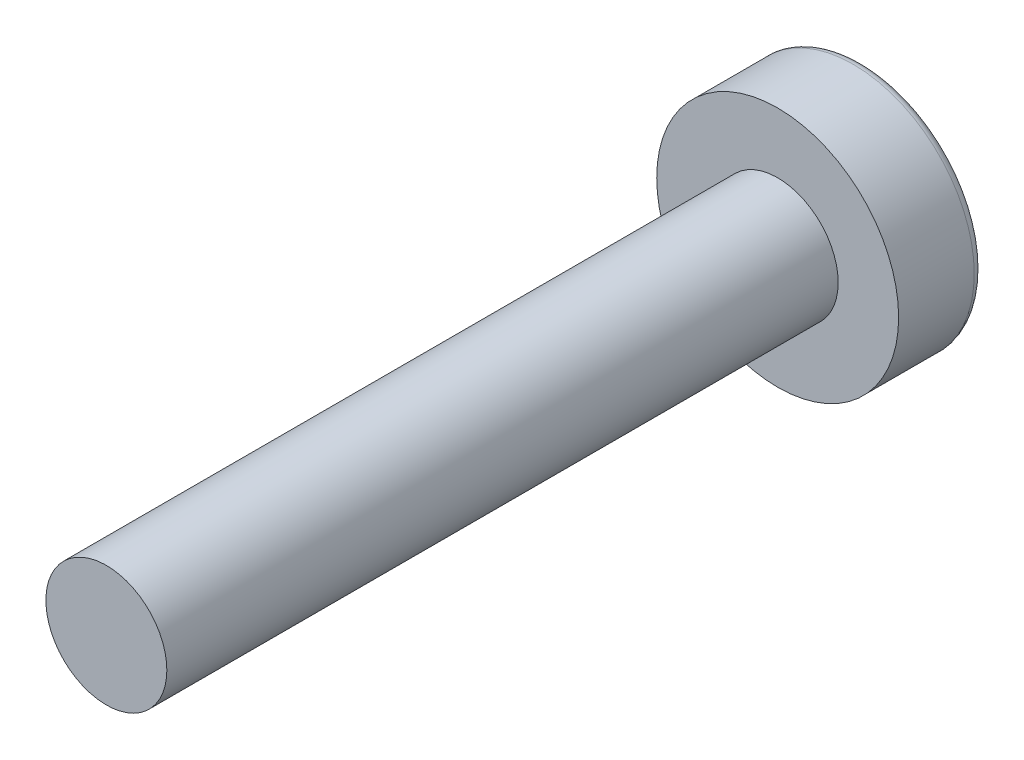
ISO-10303-21;
HEADER;
FILE_DESCRIPTION(('STEP AP214'),'2;1');
FILE_NAME('part.step','',(''),(''),'','','');
FILE_SCHEMA(('AUTOMOTIVE_DESIGN { 1 0 10303 214 1 1 1 1 }'));
ENDSEC;
DATA;
#1=APPLICATION_CONTEXT('core data for automotive mechanical design processes');
#2=APPLICATION_PROTOCOL_DEFINITION('international standard','automotive_design',2000,#1);
#3=PRODUCT_CONTEXT('',#1,'mechanical');
#4=PRODUCT('Part','Part','',(#3));
#5=PRODUCT_RELATED_PRODUCT_CATEGORY('part','',(#4));
#6=PRODUCT_DEFINITION_FORMATION('','',#4);
#7=PRODUCT_DEFINITION_CONTEXT('part definition',#1,'design');
#8=PRODUCT_DEFINITION('design','',#6,#7);
#9=PRODUCT_DEFINITION_SHAPE('','',#8);
#10=(LENGTH_UNIT() NAMED_UNIT(*) SI_UNIT(.MILLI.,.METRE.));
#11=(NAMED_UNIT(*) PLANE_ANGLE_UNIT() SI_UNIT($,.RADIAN.));
#12=(NAMED_UNIT(*) SI_UNIT($,.STERADIAN.) SOLID_ANGLE_UNIT());
#13=UNCERTAINTY_MEASURE_WITH_UNIT(LENGTH_MEASURE(1.E-05),#10,'distance_accuracy_value','');
#14=(GEOMETRIC_REPRESENTATION_CONTEXT(3) GLOBAL_UNCERTAINTY_ASSIGNED_CONTEXT((#13)) GLOBAL_UNIT_ASSIGNED_CONTEXT((#10,
#11,#12)) REPRESENTATION_CONTEXT('',''));
#15=CARTESIAN_POINT('',(0.,0.,0.));
#16=DIRECTION('',(0.,0.,1.));
#17=DIRECTION('',(1.,0.,0.));
#18=AXIS2_PLACEMENT_3D('',#15,#16,#17);
#19=CARTESIAN_POINT('',(0.,0.,2.8));
#20=DIRECTION('',(0.,0.,-1.));
#21=DIRECTION('',(-1.,0.,0.));
#22=AXIS2_PLACEMENT_3D('',#19,#20,#21);
#23=CYLINDRICAL_SURFACE('',#22,4.);
#24=CARTESIAN_POINT('',(0.,0.,0.3));
#25=DIRECTION('',(0.,0.,1.));
#26=DIRECTION('',(1.,0.,0.));
#27=AXIS2_PLACEMENT_3D('',#24,#25,#26);
#28=CIRCLE('',#27,4.);
#29=CARTESIAN_POINT('',(4.,0.,0.3));
#30=VERTEX_POINT('',#29);
#31=EDGE_CURVE('E45',#30,#30,#28,.T.);
#32=ORIENTED_EDGE('',*,*,#31,.T.);
#33=EDGE_LOOP('',(#32));
#34=FACE_BOUND('',#33,.T.);
#35=CARTESIAN_POINT('',(0.,0.,2.8));
#36=DIRECTION('',(0.,0.,1.));
#37=DIRECTION('',(1.,0.,0.));
#38=AXIS2_PLACEMENT_3D('',#35,#36,#37);
#39=CIRCLE('',#38,4.);
#40=CARTESIAN_POINT('',(4.,0.,2.8));
#41=VERTEX_POINT('',#40);
#42=EDGE_CURVE('E55',#41,#41,#39,.T.);
#43=ORIENTED_EDGE('',*,*,#42,.F.);
#44=EDGE_LOOP('',(#43));
#45=FACE_BOUND('',#44,.T.);
#46=ADVANCED_FACE('F37',(#34,#45),#23,.T.);
#47=CARTESIAN_POINT('',(0.,0.,2.8));
#48=DIRECTION('',(0.,0.,1.));
#49=DIRECTION('',(1.,0.,0.));
#50=AXIS2_PLACEMENT_3D('',#47,#48,#49);
#51=PLANE('',#50);
#52=CARTESIAN_POINT('',(0.,0.,2.8));
#53=DIRECTION('',(0.,0.,1.));
#54=DIRECTION('',(1.,0.,0.));
#55=AXIS2_PLACEMENT_3D('',#52,#53,#54);
#56=CIRCLE('',#55,2.);
#57=CARTESIAN_POINT('',(2.,0.,2.8));
#58=VERTEX_POINT('',#57);
#59=EDGE_CURVE('E50',#58,#58,#56,.T.);
#60=ORIENTED_EDGE('',*,*,#59,.F.);
#61=EDGE_LOOP('',(#60));
#62=FACE_BOUND('',#61,.T.);
#63=ORIENTED_EDGE('',*,*,#42,.T.);
#64=EDGE_LOOP('',(#63));
#65=FACE_BOUND('',#64,.T.);
#66=ADVANCED_FACE('F75',(#62,#65),#51,.T.);
#67=CARTESIAN_POINT('',(0.,0.,0.));
#68=DIRECTION('',(0.,0.,1.));
#69=DIRECTION('',(1.,0.,0.));
#70=AXIS2_PLACEMENT_3D('',#67,#68,#69);
#71=PLANE('',#70);
#72=CARTESIAN_POINT('',(0.,0.,0.));
#73=DIRECTION('',(0.,0.,1.));
#74=DIRECTION('',(1.,0.,0.));
#75=AXIS2_PLACEMENT_3D('',#72,#73,#74);
#76=CIRCLE('',#75,3.7);
#77=CARTESIAN_POINT('',(3.7,0.,0.));
#78=VERTEX_POINT('',#77);
#79=EDGE_CURVE('E10',#78,#78,#76,.F.);
#80=ORIENTED_EDGE('',*,*,#79,.T.);
#81=EDGE_LOOP('',(#80));
#82=FACE_BOUND('',#81,.T.);
#83=ADVANCED_FACE('F71',(#82),#71,.F.);
#84=CARTESIAN_POINT('',(0.,0.,25.));
#85=DIRECTION('',(0.,0.,-1.));
#86=DIRECTION('',(-1.,0.,0.));
#87=AXIS2_PLACEMENT_3D('',#84,#85,#86);
#88=CYLINDRICAL_SURFACE('',#87,2.);
#89=CARTESIAN_POINT('',(0.,0.,25.));
#90=DIRECTION('',(0.,0.,1.));
#91=DIRECTION('',(1.,0.,0.));
#92=AXIS2_PLACEMENT_3D('',#89,#90,#91);
#93=CIRCLE('',#92,2.);
#94=CARTESIAN_POINT('',(2.,0.,25.));
#95=VERTEX_POINT('',#94);
#96=EDGE_CURVE('E60',#95,#95,#93,.T.);
#97=ORIENTED_EDGE('',*,*,#96,.F.);
#98=EDGE_LOOP('',(#97));
#99=FACE_BOUND('',#98,.T.);
#100=ORIENTED_EDGE('',*,*,#59,.T.);
#101=EDGE_LOOP('',(#100));
#102=FACE_BOUND('',#101,.T.);
#103=ADVANCED_FACE('F68',(#99,#102),#88,.T.);
#104=CARTESIAN_POINT('',(0.,0.,25.));
#105=DIRECTION('',(0.,0.,1.));
#106=DIRECTION('',(1.,0.,0.));
#107=AXIS2_PLACEMENT_3D('',#104,#105,#106);
#108=PLANE('',#107);
#109=ORIENTED_EDGE('',*,*,#96,.T.);
#110=EDGE_LOOP('',(#109));
#111=FACE_BOUND('',#110,.T.);
#112=ADVANCED_FACE('F66',(#111),#108,.T.);
#113=CARTESIAN_POINT('',(0.,0.,0.3));
#114=DIRECTION('',(0.,0.,1.));
#115=DIRECTION('',(1.,0.,0.));
#116=AXIS2_PLACEMENT_3D('',#113,#114,#115);
#117=TOROIDAL_SURFACE('',#116,3.7,0.3);
#118=ORIENTED_EDGE('',*,*,#79,.F.);
#119=EDGE_LOOP('',(#118));
#120=FACE_BOUND('',#119,.T.);
#121=ORIENTED_EDGE('',*,*,#31,.F.);
#122=EDGE_LOOP('',(#121));
#123=FACE_BOUND('',#122,.T.);
#124=ADVANCED_FACE('F39',(#120,#123),#117,.T.);
#125=CLOSED_SHELL('',(#46,#66,#83,#103,#112,#124));
#126=MANIFOLD_SOLID_BREP('B2',#125);
#127=ADVANCED_BREP_SHAPE_REPRESENTATION('',(#18,#126),#14);
#128=SHAPE_DEFINITION_REPRESENTATION(#9,#127);
ENDSEC;
END-ISO-10303-21;
